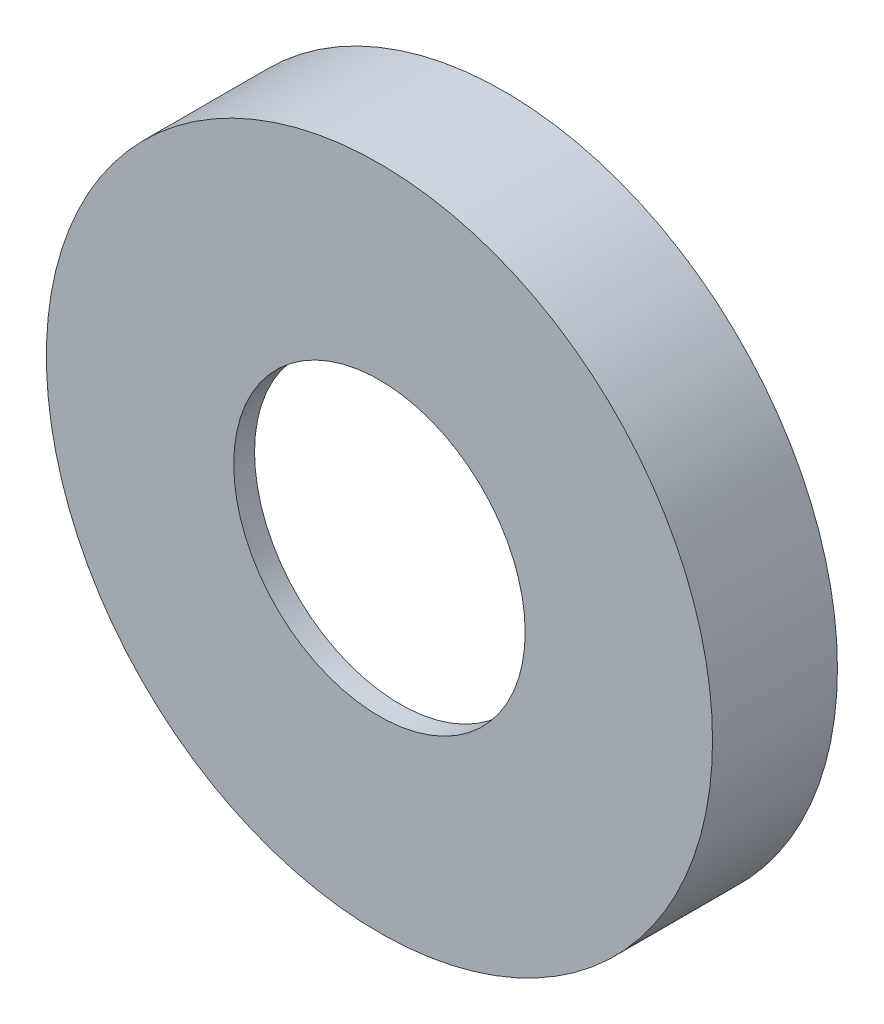
ISO-10303-21;
HEADER;
FILE_DESCRIPTION(('STEP AP214'),'2;1');
FILE_NAME('part.step','',(''),(''),'','','');
FILE_SCHEMA(('AUTOMOTIVE_DESIGN { 1 0 10303 214 1 1 1 1 }'));
ENDSEC;
DATA;
#1=APPLICATION_CONTEXT('core data for automotive mechanical design processes');
#2=APPLICATION_PROTOCOL_DEFINITION('international standard','automotive_design',2000,#1);
#3=PRODUCT_CONTEXT('',#1,'mechanical');
#4=PRODUCT('Part','Part','',(#3));
#5=PRODUCT_RELATED_PRODUCT_CATEGORY('part','',(#4));
#6=PRODUCT_DEFINITION_FORMATION('','',#4);
#7=PRODUCT_DEFINITION_CONTEXT('part definition',#1,'design');
#8=PRODUCT_DEFINITION('design','',#6,#7);
#9=PRODUCT_DEFINITION_SHAPE('','',#8);
#10=(LENGTH_UNIT() NAMED_UNIT(*) SI_UNIT(.MILLI.,.METRE.));
#11=(NAMED_UNIT(*) PLANE_ANGLE_UNIT() SI_UNIT($,.RADIAN.));
#12=(NAMED_UNIT(*) SI_UNIT($,.STERADIAN.) SOLID_ANGLE_UNIT());
#13=UNCERTAINTY_MEASURE_WITH_UNIT(LENGTH_MEASURE(1.E-05),#10,'distance_accuracy_value','');
#14=(GEOMETRIC_REPRESENTATION_CONTEXT(3) GLOBAL_UNCERTAINTY_ASSIGNED_CONTEXT((#13)) GLOBAL_UNIT_ASSIGNED_CONTEXT((#10,
#11,#12)) REPRESENTATION_CONTEXT('',''));
#15=CARTESIAN_POINT('',(0.,0.,0.));
#16=DIRECTION('',(0.,0.,1.));
#17=DIRECTION('',(1.,0.,0.));
#18=AXIS2_PLACEMENT_3D('',#15,#16,#17);
#19=CARTESIAN_POINT('',(0.,0.,3.));
#20=DIRECTION('',(0.,0.,-1.));
#21=DIRECTION('',(-1.,0.,0.));
#22=AXIS2_PLACEMENT_3D('',#19,#20,#21);
#23=CYLINDRICAL_SURFACE('',#22,8.);
#24=CARTESIAN_POINT('',(0.,0.,3.));
#25=DIRECTION('',(0.,0.,1.));
#26=DIRECTION('',(1.,0.,0.));
#27=AXIS2_PLACEMENT_3D('',#24,#25,#26);
#28=CIRCLE('',#27,8.);
#29=CARTESIAN_POINT('',(8.,0.,3.));
#30=VERTEX_POINT('',#29);
#31=EDGE_CURVE('E10',#30,#30,#28,.T.);
#32=ORIENTED_EDGE('',*,*,#31,.F.);
#33=EDGE_LOOP('',(#32));
#34=FACE_BOUND('',#33,.T.);
#35=CARTESIAN_POINT('',(0.,0.,0.));
#36=DIRECTION('',(0.,0.,1.));
#37=DIRECTION('',(1.,0.,0.));
#38=AXIS2_PLACEMENT_3D('',#35,#36,#37);
#39=CIRCLE('',#38,8.);
#40=CARTESIAN_POINT('',(8.,0.,0.));
#41=VERTEX_POINT('',#40);
#42=EDGE_CURVE('E37',#41,#41,#39,.T.);
#43=ORIENTED_EDGE('',*,*,#42,.T.);
#44=EDGE_LOOP('',(#43));
#45=FACE_BOUND('',#44,.T.);
#46=ADVANCED_FACE('F30',(#34,#45),#23,.T.);
#47=CARTESIAN_POINT('',(0.,0.,3.));
#48=DIRECTION('',(0.,0.,1.));
#49=DIRECTION('',(1.,0.,0.));
#50=AXIS2_PLACEMENT_3D('',#47,#48,#49);
#51=PLANE('',#50);
#52=CARTESIAN_POINT('',(0.,0.,3.));
#53=DIRECTION('',(0.,0.,1.));
#54=DIRECTION('',(1.,0.,0.));
#55=AXIS2_PLACEMENT_3D('',#52,#53,#54);
#56=CIRCLE('',#55,3.5);
#57=CARTESIAN_POINT('',(3.5,0.,3.));
#58=VERTEX_POINT('',#57);
#59=EDGE_CURVE('E49',#58,#58,#56,.T.);
#60=ORIENTED_EDGE('',*,*,#59,.F.);
#61=EDGE_LOOP('',(#60));
#62=FACE_BOUND('',#61,.T.);
#63=ORIENTED_EDGE('',*,*,#31,.T.);
#64=EDGE_LOOP('',(#63));
#65=FACE_BOUND('',#64,.T.);
#66=ADVANCED_FACE('F69',(#62,#65),#51,.T.);
#67=CARTESIAN_POINT('',(0.,0.,0.));
#68=DIRECTION('',(0.,0.,1.));
#69=DIRECTION('',(1.,0.,0.));
#70=AXIS2_PLACEMENT_3D('',#67,#68,#69);
#71=PLANE('',#70);
#72=CARTESIAN_POINT('',(0.,0.,0.));
#73=DIRECTION('',(0.,0.,1.));
#74=DIRECTION('',(1.,0.,0.));
#75=AXIS2_PLACEMENT_3D('',#72,#73,#74);
#76=CIRCLE('',#75,7.5);
#77=CARTESIAN_POINT('',(7.5,0.,0.));
#78=VERTEX_POINT('',#77);
#79=EDGE_CURVE('E44',#78,#78,#76,.T.);
#80=ORIENTED_EDGE('',*,*,#79,.T.);
#81=EDGE_LOOP('',(#80));
#82=FACE_BOUND('',#81,.T.);
#83=ORIENTED_EDGE('',*,*,#42,.F.);
#84=EDGE_LOOP('',(#83));
#85=FACE_BOUND('',#84,.T.);
#86=ADVANCED_FACE('F74',(#82,#85),#71,.F.);
#87=CARTESIAN_POINT('',(0.,0.,3.));
#88=DIRECTION('',(0.,0.,-1.));
#89=DIRECTION('',(-1.,0.,0.));
#90=AXIS2_PLACEMENT_3D('',#87,#88,#89);
#91=CYLINDRICAL_SURFACE('',#90,7.5);
#92=CARTESIAN_POINT('',(0.,0.,2.5));
#93=DIRECTION('',(0.,0.,1.));
#94=DIRECTION('',(1.,0.,0.));
#95=AXIS2_PLACEMENT_3D('',#92,#93,#94);
#96=CIRCLE('',#95,7.5);
#97=CARTESIAN_POINT('',(7.5,0.,2.5));
#98=VERTEX_POINT('',#97);
#99=EDGE_CURVE('E42',#98,#98,#96,.T.);
#100=ORIENTED_EDGE('',*,*,#99,.T.);
#101=EDGE_LOOP('',(#100));
#102=FACE_BOUND('',#101,.T.);
#103=ORIENTED_EDGE('',*,*,#79,.F.);
#104=EDGE_LOOP('',(#103));
#105=FACE_BOUND('',#104,.T.);
#106=ADVANCED_FACE('F65',(#102,#105),#91,.F.);
#107=CARTESIAN_POINT('',(0.,0.,2.5));
#108=DIRECTION('',(0.,0.,1.));
#109=DIRECTION('',(1.,0.,0.));
#110=AXIS2_PLACEMENT_3D('',#107,#108,#109);
#111=PLANE('',#110);
#112=CARTESIAN_POINT('',(0.,0.,2.5));
#113=DIRECTION('',(0.,0.,1.));
#114=DIRECTION('',(1.,0.,0.));
#115=AXIS2_PLACEMENT_3D('',#112,#113,#114);
#116=CIRCLE('',#115,3.5);
#117=CARTESIAN_POINT('',(3.5,0.,2.5));
#118=VERTEX_POINT('',#117);
#119=EDGE_CURVE('E33',#118,#118,#116,.T.);
#120=ORIENTED_EDGE('',*,*,#119,.T.);
#121=EDGE_LOOP('',(#120));
#122=FACE_BOUND('',#121,.T.);
#123=ORIENTED_EDGE('',*,*,#99,.F.);
#124=EDGE_LOOP('',(#123));
#125=FACE_BOUND('',#124,.T.);
#126=ADVANCED_FACE('F56',(#122,#125),#111,.F.);
#127=CARTESIAN_POINT('',(0.,0.,0.));
#128=DIRECTION('',(0.,0.,1.));
#129=DIRECTION('',(1.,0.,0.));
#130=AXIS2_PLACEMENT_3D('',#127,#128,#129);
#131=CYLINDRICAL_SURFACE('',#130,3.5);
#132=ORIENTED_EDGE('',*,*,#59,.T.);
#133=EDGE_LOOP('',(#132));
#134=FACE_BOUND('',#133,.T.);
#135=ORIENTED_EDGE('',*,*,#119,.F.);
#136=EDGE_LOOP('',(#135));
#137=FACE_BOUND('',#136,.T.);
#138=ADVANCED_FACE('F59',(#134,#137),#131,.F.);
#139=CLOSED_SHELL('',(#46,#66,#86,#106,#126,#138));
#140=MANIFOLD_SOLID_BREP('B2',#139);
#141=ADVANCED_BREP_SHAPE_REPRESENTATION('',(#18,#140),#14);
#142=SHAPE_DEFINITION_REPRESENTATION(#9,#141);
ENDSEC;
END-ISO-10303-21;
